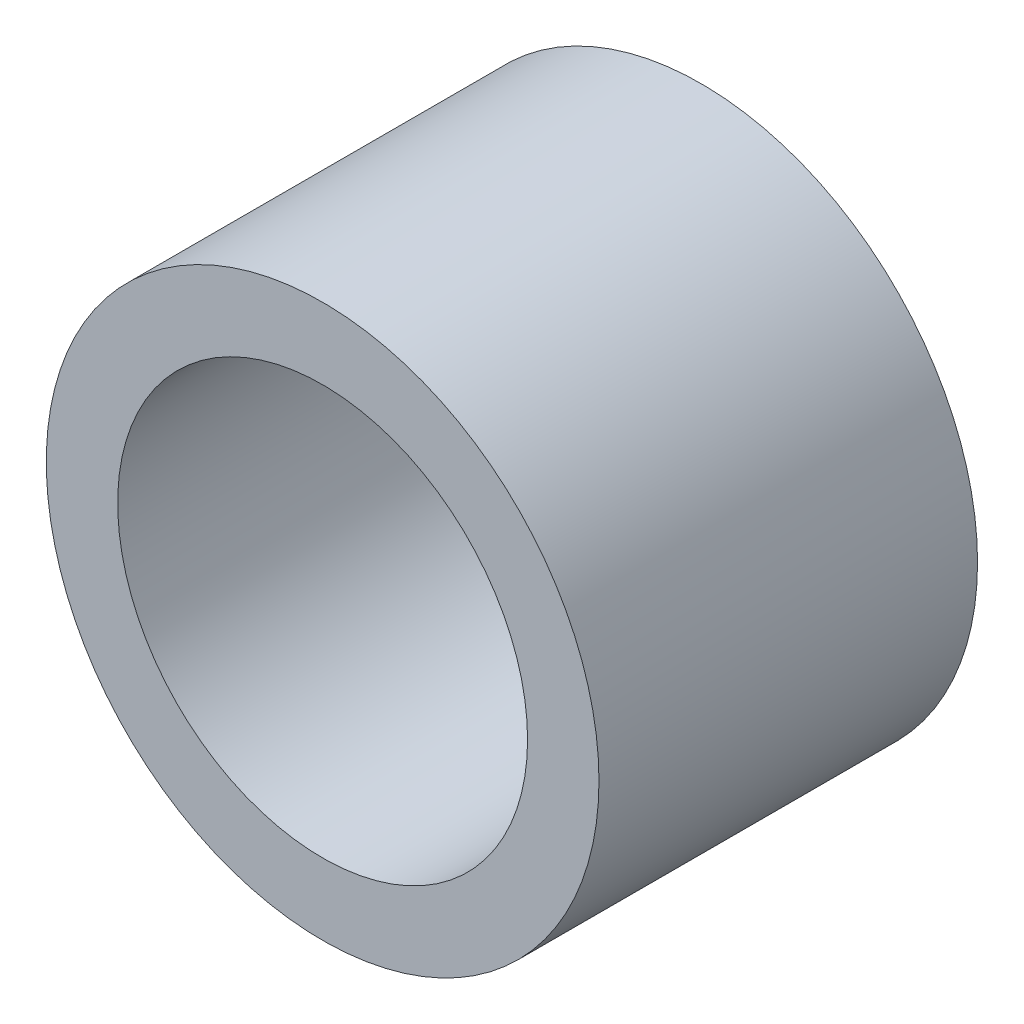
ISO-10303-21;
HEADER;
FILE_DESCRIPTION(('STEP AP214'),'2;1');
FILE_NAME('part.step','',(''),(''),'','','');
FILE_SCHEMA(('AUTOMOTIVE_DESIGN { 1 0 10303 214 1 1 1 1 }'));
ENDSEC;
DATA;
#1=APPLICATION_CONTEXT('core data for automotive mechanical design processes');
#2=APPLICATION_PROTOCOL_DEFINITION('international standard','automotive_design',2000,#1);
#3=PRODUCT_CONTEXT('',#1,'mechanical');
#4=PRODUCT('Part','Part','',(#3));
#5=PRODUCT_RELATED_PRODUCT_CATEGORY('part','',(#4));
#6=PRODUCT_DEFINITION_FORMATION('','',#4);
#7=PRODUCT_DEFINITION_CONTEXT('part definition',#1,'design');
#8=PRODUCT_DEFINITION('design','',#6,#7);
#9=PRODUCT_DEFINITION_SHAPE('','',#8);
#10=(LENGTH_UNIT() NAMED_UNIT(*) SI_UNIT(.MILLI.,.METRE.));
#11=(NAMED_UNIT(*) PLANE_ANGLE_UNIT() SI_UNIT($,.RADIAN.));
#12=(NAMED_UNIT(*) SI_UNIT($,.STERADIAN.) SOLID_ANGLE_UNIT());
#13=UNCERTAINTY_MEASURE_WITH_UNIT(LENGTH_MEASURE(1.E-05),#10,'distance_accuracy_value','');
#14=(GEOMETRIC_REPRESENTATION_CONTEXT(3) GLOBAL_UNCERTAINTY_ASSIGNED_CONTEXT((#13)) GLOBAL_UNIT_ASSIGNED_CONTEXT((#10,
#11,#12)) REPRESENTATION_CONTEXT('',''));
#15=CARTESIAN_POINT('',(0.,0.,0.));
#16=DIRECTION('',(0.,0.,1.));
#17=DIRECTION('',(1.,0.,0.));
#18=AXIS2_PLACEMENT_3D('',#15,#16,#17);
#19=CARTESIAN_POINT('',(0.,0.,12.7));
#20=DIRECTION('',(0.,0.,1.));
#21=DIRECTION('',(1.,0.,0.));
#22=AXIS2_PLACEMENT_3D('',#19,#20,#21);
#23=PLANE('',#22);
#24=CARTESIAN_POINT('',(0.,0.,12.7));
#25=DIRECTION('',(0.,0.,1.));
#26=DIRECTION('',(1.,0.,0.));
#27=AXIS2_PLACEMENT_3D('',#24,#25,#26);
#28=CIRCLE('',#27,9.271);
#29=CARTESIAN_POINT('',(9.271,0.,12.7));
#30=VERTEX_POINT('',#29);
#31=EDGE_CURVE('E10',#30,#30,#28,.T.);
#32=ORIENTED_EDGE('',*,*,#31,.T.);
#33=EDGE_LOOP('',(#32));
#34=FACE_BOUND('',#33,.T.);
#35=CARTESIAN_POINT('',(0.,0.,12.7));
#36=DIRECTION('',(0.,0.,1.));
#37=DIRECTION('',(1.,0.,0.));
#38=AXIS2_PLACEMENT_3D('',#35,#36,#37);
#39=CIRCLE('',#38,6.87578);
#40=CARTESIAN_POINT('',(6.87578,0.,12.7));
#41=VERTEX_POINT('',#40);
#42=EDGE_CURVE('E52',#41,#41,#39,.T.);
#43=ORIENTED_EDGE('',*,*,#42,.F.);
#44=EDGE_LOOP('',(#43));
#45=FACE_BOUND('',#44,.T.);
#46=ADVANCED_FACE('F39',(#34,#45),#23,.T.);
#47=CARTESIAN_POINT('',(0.,0.,0.));
#48=DIRECTION('',(0.,0.,1.));
#49=DIRECTION('',(1.,0.,0.));
#50=AXIS2_PLACEMENT_3D('',#47,#48,#49);
#51=PLANE('',#50);
#52=CARTESIAN_POINT('',(0.,0.,0.));
#53=DIRECTION('',(0.,0.,1.));
#54=DIRECTION('',(1.,0.,0.));
#55=AXIS2_PLACEMENT_3D('',#52,#53,#54);
#56=CIRCLE('',#55,9.271);
#57=CARTESIAN_POINT('',(9.271,0.,0.));
#58=VERTEX_POINT('',#57);
#59=EDGE_CURVE('E43',#58,#58,#56,.T.);
#60=ORIENTED_EDGE('',*,*,#59,.F.);
#61=EDGE_LOOP('',(#60));
#62=FACE_BOUND('',#61,.T.);
#63=CARTESIAN_POINT('',(0.,0.,0.));
#64=DIRECTION('',(0.,0.,1.));
#65=DIRECTION('',(1.,0.,0.));
#66=AXIS2_PLACEMENT_3D('',#63,#64,#65);
#67=CIRCLE('',#66,6.87578);
#68=CARTESIAN_POINT('',(6.87578,0.,0.));
#69=VERTEX_POINT('',#68);
#70=EDGE_CURVE('E54',#69,#69,#67,.T.);
#71=ORIENTED_EDGE('',*,*,#70,.T.);
#72=EDGE_LOOP('',(#71));
#73=FACE_BOUND('',#72,.T.);
#74=ADVANCED_FACE('F66',(#62,#73),#51,.F.);
#75=CARTESIAN_POINT('',(0.,0.,12.7));
#76=DIRECTION('',(0.,0.,-1.));
#77=DIRECTION('',(-1.,0.,0.));
#78=AXIS2_PLACEMENT_3D('',#75,#76,#77);
#79=CYLINDRICAL_SURFACE('',#78,9.271);
#80=ORIENTED_EDGE('',*,*,#31,.F.);
#81=EDGE_LOOP('',(#80));
#82=FACE_BOUND('',#81,.T.);
#83=ORIENTED_EDGE('',*,*,#59,.T.);
#84=EDGE_LOOP('',(#83));
#85=FACE_BOUND('',#84,.T.);
#86=ADVANCED_FACE('F41',(#82,#85),#79,.T.);
#87=CARTESIAN_POINT('',(0.,0.,12.7));
#88=DIRECTION('',(0.,0.,-1.));
#89=DIRECTION('',(-1.,0.,0.));
#90=AXIS2_PLACEMENT_3D('',#87,#88,#89);
#91=CYLINDRICAL_SURFACE('',#90,6.87578);
#92=ORIENTED_EDGE('',*,*,#42,.T.);
#93=EDGE_LOOP('',(#92));
#94=FACE_BOUND('',#93,.T.);
#95=ORIENTED_EDGE('',*,*,#70,.F.);
#96=EDGE_LOOP('',(#95));
#97=FACE_BOUND('',#96,.T.);
#98=ADVANCED_FACE('F62',(#94,#97),#91,.F.);
#99=CLOSED_SHELL('',(#46,#74,#86,#98));
#100=MANIFOLD_SOLID_BREP('B2',#99);
#101=ADVANCED_BREP_SHAPE_REPRESENTATION('',(#18,#100),#14);
#102=SHAPE_DEFINITION_REPRESENTATION(#9,#101);
ENDSEC;
END-ISO-10303-21;
